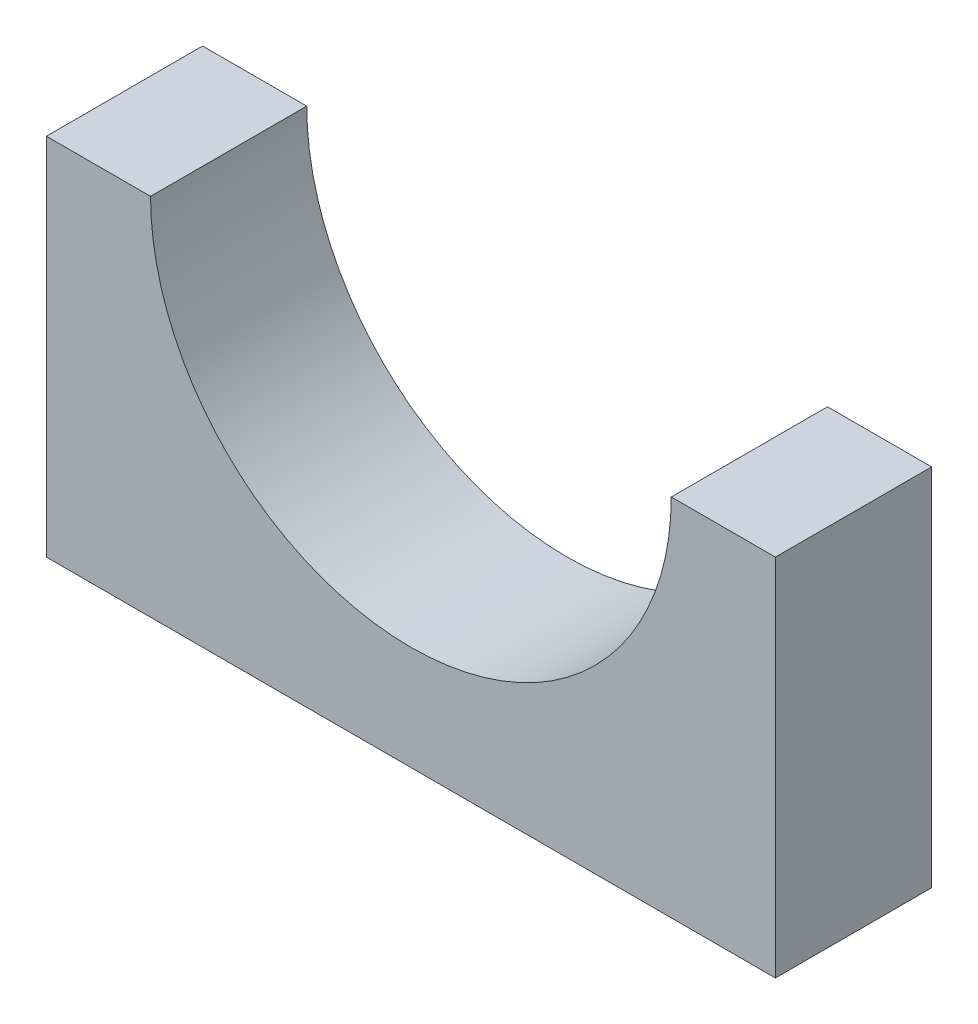
ISO-10303-21;
HEADER;
FILE_DESCRIPTION(('STEP AP214'),'2;1');
FILE_NAME('part.step','',(''),(''),'','','');
FILE_SCHEMA(('AUTOMOTIVE_DESIGN { 1 0 10303 214 1 1 1 1 }'));
ENDSEC;
DATA;
#1=APPLICATION_CONTEXT('core data for automotive mechanical design processes');
#2=APPLICATION_PROTOCOL_DEFINITION('international standard','automotive_design',2000,#1);
#3=PRODUCT_CONTEXT('',#1,'mechanical');
#4=PRODUCT('Part','Part','',(#3));
#5=PRODUCT_RELATED_PRODUCT_CATEGORY('part','',(#4));
#6=PRODUCT_DEFINITION_FORMATION('','',#4);
#7=PRODUCT_DEFINITION_CONTEXT('part definition',#1,'design');
#8=PRODUCT_DEFINITION('design','',#6,#7);
#9=PRODUCT_DEFINITION_SHAPE('','',#8);
#10=(LENGTH_UNIT() NAMED_UNIT(*) SI_UNIT(.MILLI.,.METRE.));
#11=(NAMED_UNIT(*) PLANE_ANGLE_UNIT() SI_UNIT($,.RADIAN.));
#12=(NAMED_UNIT(*) SI_UNIT($,.STERADIAN.) SOLID_ANGLE_UNIT());
#13=UNCERTAINTY_MEASURE_WITH_UNIT(LENGTH_MEASURE(1.E-05),#10,'distance_accuracy_value','');
#14=(GEOMETRIC_REPRESENTATION_CONTEXT(3) GLOBAL_UNCERTAINTY_ASSIGNED_CONTEXT((#13)) GLOBAL_UNIT_ASSIGNED_CONTEXT((#10,
#11,#12)) REPRESENTATION_CONTEXT('',''));
#15=CARTESIAN_POINT('',(0.,0.,0.));
#16=DIRECTION('',(0.,0.,1.));
#17=DIRECTION('',(1.,0.,0.));
#18=AXIS2_PLACEMENT_3D('',#15,#16,#17);
#19=CARTESIAN_POINT('',(17.5,0.,7.5));
#20=DIRECTION('',(-1.,0.,0.));
#21=DIRECTION('',(0.,0.,1.));
#22=AXIS2_PLACEMENT_3D('',#19,#20,#21);
#23=PLANE('',#22);
#24=DIRECTION('',(0.,1.,0.));
#25=VECTOR('',#24,1.);
#26=CARTESIAN_POINT('',(17.5,0.,0.));
#27=LINE('',#26,#25);
#28=CARTESIAN_POINT('',(17.5,0.,0.));
#29=VERTEX_POINT('',#28);
#30=CARTESIAN_POINT('',(17.5,17.5,0.));
#31=VERTEX_POINT('',#30);
#32=EDGE_CURVE('E121',#29,#31,#27,.T.);
#33=ORIENTED_EDGE('',*,*,#32,.T.);
#34=DIRECTION('',(0.,0.,-1.));
#35=VECTOR('',#34,1.);
#36=CARTESIAN_POINT('',(17.5,17.5,7.5));
#37=LINE('',#36,#35);
#38=CARTESIAN_POINT('',(17.5,17.5,7.5));
#39=VERTEX_POINT('',#38);
#40=EDGE_CURVE('E11',#39,#31,#37,.T.);
#41=ORIENTED_EDGE('',*,*,#40,.F.);
#42=DIRECTION('',(0.,1.,0.));
#43=VECTOR('',#42,1.);
#44=CARTESIAN_POINT('',(17.5,0.,7.5));
#45=LINE('',#44,#43);
#46=CARTESIAN_POINT('',(17.5,0.,7.5));
#47=VERTEX_POINT('',#46);
#48=EDGE_CURVE('E131',#47,#39,#45,.T.);
#49=ORIENTED_EDGE('',*,*,#48,.F.);
#50=DIRECTION('',(0.,0.,-1.));
#51=VECTOR('',#50,1.);
#52=CARTESIAN_POINT('',(17.5,0.,7.5));
#53=LINE('',#52,#51);
#54=EDGE_CURVE('E117',#47,#29,#53,.T.);
#55=ORIENTED_EDGE('',*,*,#54,.T.);
#56=EDGE_LOOP('',(#33,#41,#49,#55));
#57=FACE_BOUND('',#56,.T.);
#58=ADVANCED_FACE('F37',(#57),#23,.F.);
#59=CARTESIAN_POINT('',(17.5,17.5,7.5));
#60=DIRECTION('',(0.,-1.,0.));
#61=DIRECTION('',(1.,0.,0.));
#62=AXIS2_PLACEMENT_3D('',#59,#60,#61);
#63=PLANE('',#62);
#64=DIRECTION('',(-1.,0.,0.));
#65=VECTOR('',#64,1.);
#66=CARTESIAN_POINT('',(17.5,17.5,0.));
#67=LINE('',#66,#65);
#68=CARTESIAN_POINT('',(12.5,17.5,0.));
#69=VERTEX_POINT('',#68);
#70=EDGE_CURVE('E124',#31,#69,#67,.T.);
#71=ORIENTED_EDGE('',*,*,#70,.T.);
#72=DIRECTION('',(0.,0.,-1.));
#73=VECTOR('',#72,1.);
#74=CARTESIAN_POINT('',(12.5,17.5,7.5));
#75=LINE('',#74,#73);
#76=CARTESIAN_POINT('',(12.5,17.5,7.5));
#77=VERTEX_POINT('',#76);
#78=EDGE_CURVE('E45',#77,#69,#75,.T.);
#79=ORIENTED_EDGE('',*,*,#78,.F.);
#80=DIRECTION('',(-1.,0.,0.));
#81=VECTOR('',#80,1.);
#82=CARTESIAN_POINT('',(17.5,17.5,7.5));
#83=LINE('',#82,#81);
#84=EDGE_CURVE('E90',#39,#77,#83,.T.);
#85=ORIENTED_EDGE('',*,*,#84,.F.);
#86=ORIENTED_EDGE('',*,*,#40,.T.);
#87=EDGE_LOOP('',(#71,#79,#85,#86));
#88=FACE_BOUND('',#87,.T.);
#89=ADVANCED_FACE('F155',(#88),#63,.F.);
#90=CARTESIAN_POINT('',(0.,17.5,7.5));
#91=DIRECTION('',(0.,0.,-1.));
#92=DIRECTION('',(-1.,0.,0.));
#93=AXIS2_PLACEMENT_3D('',#90,#91,#92);
#94=CYLINDRICAL_SURFACE('',#93,12.5);
#95=CARTESIAN_POINT('',(0.,17.5,0.));
#96=DIRECTION('',(0.,0.,-1.));
#97=DIRECTION('',(1.,0.,0.));
#98=AXIS2_PLACEMENT_3D('',#95,#96,#97);
#99=CIRCLE('',#98,12.5);
#100=CARTESIAN_POINT('',(-12.5,17.5,0.));
#101=VERTEX_POINT('',#100);
#102=EDGE_CURVE('E126',#69,#101,#99,.T.);
#103=ORIENTED_EDGE('',*,*,#102,.T.);
#104=DIRECTION('',(0.,0.,-1.));
#105=VECTOR('',#104,1.);
#106=CARTESIAN_POINT('',(-12.5,17.5,7.5));
#107=LINE('',#106,#105);
#108=CARTESIAN_POINT('',(-12.5,17.5,7.5));
#109=VERTEX_POINT('',#108);
#110=EDGE_CURVE('E112',#109,#101,#107,.T.);
#111=ORIENTED_EDGE('',*,*,#110,.F.);
#112=CARTESIAN_POINT('',(0.,17.5,7.5));
#113=DIRECTION('',(0.,0.,-1.));
#114=DIRECTION('',(1.,0.,0.));
#115=AXIS2_PLACEMENT_3D('',#112,#113,#114);
#116=CIRCLE('',#115,12.5);
#117=EDGE_CURVE('E103',#77,#109,#116,.T.);
#118=ORIENTED_EDGE('',*,*,#117,.F.);
#119=ORIENTED_EDGE('',*,*,#78,.T.);
#120=EDGE_LOOP('',(#103,#111,#118,#119));
#121=FACE_BOUND('',#120,.T.);
#122=ADVANCED_FACE('F137',(#121),#94,.F.);
#123=CARTESIAN_POINT('',(-17.5,17.5,7.5));
#124=DIRECTION('',(0.,-1.,0.));
#125=DIRECTION('',(0.,0.,-1.));
#126=AXIS2_PLACEMENT_3D('',#123,#124,#125);
#127=PLANE('',#126);
#128=DIRECTION('',(-1.,0.,0.));
#129=VECTOR('',#128,1.);
#130=CARTESIAN_POINT('',(-17.5,17.5,0.));
#131=LINE('',#130,#129);
#132=CARTESIAN_POINT('',(-17.5,17.5,0.));
#133=VERTEX_POINT('',#132);
#134=EDGE_CURVE('E111',#101,#133,#131,.T.);
#135=ORIENTED_EDGE('',*,*,#134,.T.);
#136=DIRECTION('',(0.,0.,-1.));
#137=VECTOR('',#136,1.);
#138=CARTESIAN_POINT('',(-17.5,17.5,7.5));
#139=LINE('',#138,#137);
#140=CARTESIAN_POINT('',(-17.5,17.5,7.5));
#141=VERTEX_POINT('',#140);
#142=EDGE_CURVE('E108',#141,#133,#139,.T.);
#143=ORIENTED_EDGE('',*,*,#142,.F.);
#144=DIRECTION('',(-1.,0.,0.));
#145=VECTOR('',#144,1.);
#146=CARTESIAN_POINT('',(-17.5,17.5,7.5));
#147=LINE('',#146,#145);
#148=EDGE_CURVE('E97',#109,#141,#147,.T.);
#149=ORIENTED_EDGE('',*,*,#148,.F.);
#150=ORIENTED_EDGE('',*,*,#110,.T.);
#151=EDGE_LOOP('',(#135,#143,#149,#150));
#152=FACE_BOUND('',#151,.T.);
#153=ADVANCED_FACE('F109',(#152),#127,.F.);
#154=CARTESIAN_POINT('',(-17.5,0.,7.5));
#155=DIRECTION('',(1.,0.,0.));
#156=DIRECTION('',(0.,0.,-1.));
#157=AXIS2_PLACEMENT_3D('',#154,#155,#156);
#158=PLANE('',#157);
#159=DIRECTION('',(0.,-1.,0.));
#160=VECTOR('',#159,1.);
#161=CARTESIAN_POINT('',(-17.5,0.,0.));
#162=LINE('',#161,#160);
#163=CARTESIAN_POINT('',(-17.5,0.,0.));
#164=VERTEX_POINT('',#163);
#165=EDGE_CURVE('E76',#133,#164,#162,.T.);
#166=ORIENTED_EDGE('',*,*,#165,.T.);
#167=DIRECTION('',(0.,0.,-1.));
#168=VECTOR('',#167,1.);
#169=CARTESIAN_POINT('',(-17.5,0.,7.5));
#170=LINE('',#169,#168);
#171=CARTESIAN_POINT('',(-17.5,0.,7.5));
#172=VERTEX_POINT('',#171);
#173=EDGE_CURVE('E113',#172,#164,#170,.T.);
#174=ORIENTED_EDGE('',*,*,#173,.F.);
#175=DIRECTION('',(0.,-1.,0.));
#176=VECTOR('',#175,1.);
#177=CARTESIAN_POINT('',(-17.5,0.,7.5));
#178=LINE('',#177,#176);
#179=EDGE_CURVE('E101',#141,#172,#178,.T.);
#180=ORIENTED_EDGE('',*,*,#179,.F.);
#181=ORIENTED_EDGE('',*,*,#142,.T.);
#182=EDGE_LOOP('',(#166,#174,#180,#181));
#183=FACE_BOUND('',#182,.T.);
#184=ADVANCED_FACE('F115',(#183),#158,.F.);
#185=CARTESIAN_POINT('',(-17.5,0.,7.5));
#186=DIRECTION('',(0.,1.,0.));
#187=DIRECTION('',(0.,0.,1.));
#188=AXIS2_PLACEMENT_3D('',#185,#186,#187);
#189=PLANE('',#188);
#190=DIRECTION('',(1.,0.,0.));
#191=VECTOR('',#190,1.);
#192=CARTESIAN_POINT('',(-17.5,0.,0.));
#193=LINE('',#192,#191);
#194=EDGE_CURVE('E82',#164,#29,#193,.T.);
#195=ORIENTED_EDGE('',*,*,#194,.T.);
#196=ORIENTED_EDGE('',*,*,#54,.F.);
#197=DIRECTION('',(1.,0.,0.));
#198=VECTOR('',#197,1.);
#199=CARTESIAN_POINT('',(-17.5,0.,7.5));
#200=LINE('',#199,#198);
#201=EDGE_CURVE('E53',#172,#47,#200,.T.);
#202=ORIENTED_EDGE('',*,*,#201,.F.);
#203=ORIENTED_EDGE('',*,*,#173,.T.);
#204=EDGE_LOOP('',(#195,#196,#202,#203));
#205=FACE_BOUND('',#204,.T.);
#206=ADVANCED_FACE('F144',(#205),#189,.F.);
#207=CARTESIAN_POINT('',(0.,17.5,7.5));
#208=DIRECTION('',(0.,0.,1.));
#209=DIRECTION('',(1.,0.,0.));
#210=AXIS2_PLACEMENT_3D('',#207,#208,#209);
#211=PLANE('',#210);
#212=ORIENTED_EDGE('',*,*,#48,.T.);
#213=ORIENTED_EDGE('',*,*,#84,.T.);
#214=ORIENTED_EDGE('',*,*,#117,.T.);
#215=ORIENTED_EDGE('',*,*,#148,.T.);
#216=ORIENTED_EDGE('',*,*,#179,.T.);
#217=ORIENTED_EDGE('',*,*,#201,.T.);
#218=EDGE_LOOP('',(#212,#213,#214,#215,#216,#217));
#219=FACE_BOUND('',#218,.T.);
#220=ADVANCED_FACE('F99',(#219),#211,.T.);
#221=CARTESIAN_POINT('',(0.,17.5,0.));
#222=DIRECTION('',(0.,0.,1.));
#223=DIRECTION('',(1.,0.,0.));
#224=AXIS2_PLACEMENT_3D('',#221,#222,#223);
#225=PLANE('',#224);
#226=ORIENTED_EDGE('',*,*,#32,.F.);
#227=ORIENTED_EDGE('',*,*,#194,.F.);
#228=ORIENTED_EDGE('',*,*,#165,.F.);
#229=ORIENTED_EDGE('',*,*,#134,.F.);
#230=ORIENTED_EDGE('',*,*,#102,.F.);
#231=ORIENTED_EDGE('',*,*,#70,.F.);
#232=EDGE_LOOP('',(#226,#227,#228,#229,#230,#231));
#233=FACE_BOUND('',#232,.T.);
#234=ADVANCED_FACE('F140',(#233),#225,.F.);
#235=CLOSED_SHELL('',(#58,#89,#122,#153,#184,#206,#220,#234));
#236=MANIFOLD_SOLID_BREP('B2',#235);
#237=ADVANCED_BREP_SHAPE_REPRESENTATION('',(#18,#236),#14);
#238=SHAPE_DEFINITION_REPRESENTATION(#9,#237);
ENDSEC;
END-ISO-10303-21;
